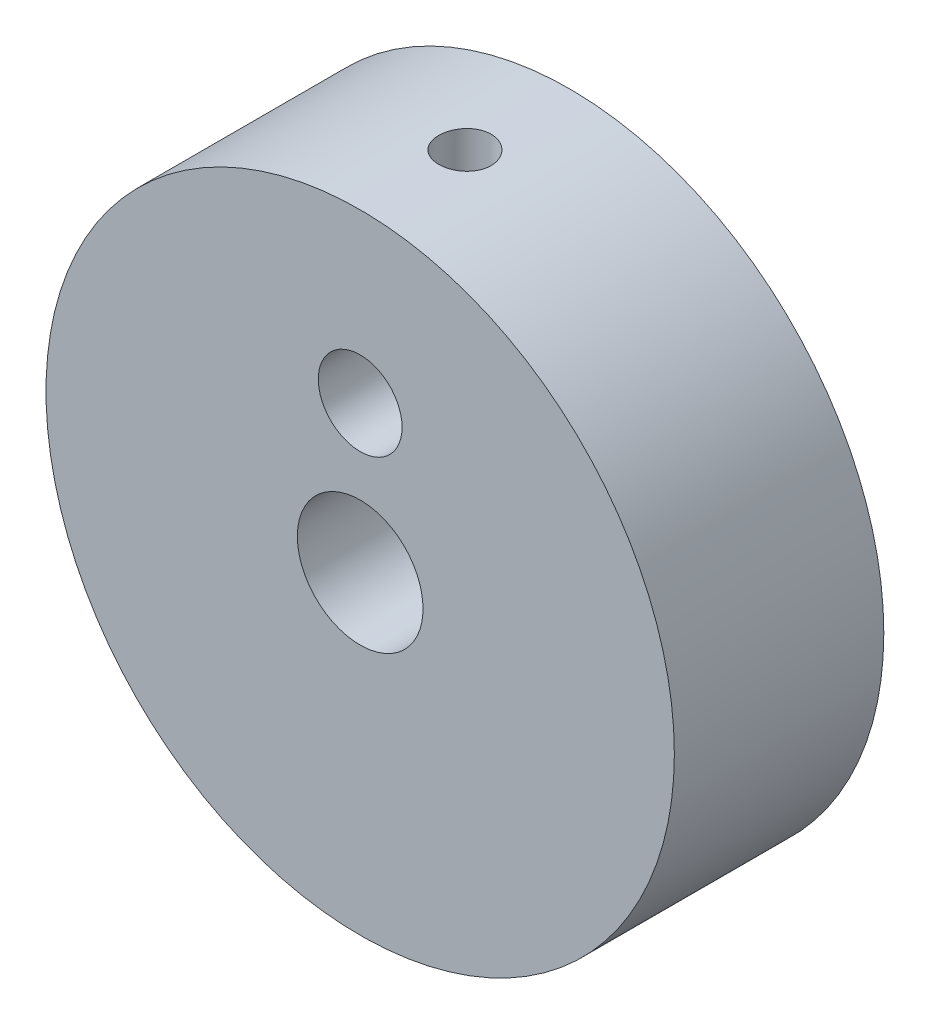
ISO-10303-21;
HEADER;
FILE_DESCRIPTION(('STEP AP214'),'2;1');
FILE_NAME('part.step','',(''),(''),'','','');
FILE_SCHEMA(('AUTOMOTIVE_DESIGN { 1 0 10303 214 1 1 1 1 }'));
ENDSEC;
DATA;
#1=APPLICATION_CONTEXT('core data for automotive mechanical design processes');
#2=APPLICATION_PROTOCOL_DEFINITION('international standard','automotive_design',2000,#1);
#3=PRODUCT_CONTEXT('',#1,'mechanical');
#4=PRODUCT('Part','Part','',(#3));
#5=PRODUCT_RELATED_PRODUCT_CATEGORY('part','',(#4));
#6=PRODUCT_DEFINITION_FORMATION('','',#4);
#7=PRODUCT_DEFINITION_CONTEXT('part definition',#1,'design');
#8=PRODUCT_DEFINITION('design','',#6,#7);
#9=PRODUCT_DEFINITION_SHAPE('','',#8);
#10=(LENGTH_UNIT() NAMED_UNIT(*) SI_UNIT(.MILLI.,.METRE.));
#11=(NAMED_UNIT(*) PLANE_ANGLE_UNIT() SI_UNIT($,.RADIAN.));
#12=(NAMED_UNIT(*) SI_UNIT($,.STERADIAN.) SOLID_ANGLE_UNIT());
#13=UNCERTAINTY_MEASURE_WITH_UNIT(LENGTH_MEASURE(1.E-05),#10,'distance_accuracy_value','');
#14=(GEOMETRIC_REPRESENTATION_CONTEXT(3) GLOBAL_UNCERTAINTY_ASSIGNED_CONTEXT((#13)) GLOBAL_UNIT_ASSIGNED_CONTEXT((#10,
#11,#12)) REPRESENTATION_CONTEXT('',''));
#15=CARTESIAN_POINT('',(0.,0.,0.));
#16=DIRECTION('',(0.,0.,1.));
#17=DIRECTION('',(1.,0.,0.));
#18=AXIS2_PLACEMENT_3D('',#15,#16,#17);
#19=CARTESIAN_POINT('',(0.,0.,10.));
#20=DIRECTION('',(0.,0.,-1.));
#21=DIRECTION('',(-1.,0.,0.));
#22=AXIS2_PLACEMENT_3D('',#19,#20,#21);
#23=CYLINDRICAL_SURFACE('',#22,15.);
#24=CARTESIAN_POINT('',(0.,-15.,3.75000000000001));
#25=CARTESIAN_POINT('',(-0.0700826124015049,-14.9999993176439,3.75000306103286));
#26=CARTESIAN_POINT('',(-0.140212933975281,-14.9995036067925,3.75591371226381));
#27=CARTESIAN_POINT('',(-0.278533213375485,-14.9975737791031,3.77940543981886));
#28=CARTESIAN_POINT('',(-0.346720881531536,-14.9961385991462,3.79699973788114));
#29=CARTESIAN_POINT('',(-0.479132528142823,-14.9924920155763,3.84334644226172));
#30=CARTESIAN_POINT('',(-0.543358725530766,-14.9902810512311,3.87209253513728));
#31=CARTESIAN_POINT('',(-0.666059041770091,-14.9853308468089,3.93991553984));
#32=CARTESIAN_POINT('',(-0.724534387356731,-14.982591719767,3.97899024184689));
#33=CARTESIAN_POINT('',(-0.834237499956983,-14.9768847483339,4.0664688332575));
#34=CARTESIAN_POINT('',(-0.885448590520196,-14.9739164010822,4.11489360491961));
#35=CARTESIAN_POINT('',(-0.979026416920687,-14.9680897600396,4.21965361981242));
#36=CARTESIAN_POINT('',(-1.02139276421438,-14.965231471088,4.27598921037828));
#37=CARTESIAN_POINT('',(-1.09613490298778,-14.9599431582655,4.39507264637379));
#38=CARTESIAN_POINT('',(-1.12849604118942,-14.9575137647512,4.45782971925347));
#39=CARTESIAN_POINT('',(-1.1822155422173,-14.9533640556034,4.58791036944498));
#40=CARTESIAN_POINT('',(-1.20357409939051,-14.9516437274454,4.65523386607281));
#41=CARTESIAN_POINT('',(-1.23463378727321,-14.949111150829,4.79236923985147));
#42=CARTESIAN_POINT('',(-1.24436208173721,-14.9482967867027,4.86217492499075));
#43=CARTESIAN_POINT('',(-1.25196901001928,-14.9476616540184,5.00243275493171));
#44=CARTESIAN_POINT('',(-1.24984786622442,-14.9478408668132,5.07288488757625));
#45=CARTESIAN_POINT('',(-1.23383858026855,-14.9491707170205,5.21224958188815));
#46=CARTESIAN_POINT('',(-1.21997996004757,-14.9503189172232,5.28116556134551));
#47=CARTESIAN_POINT('',(-1.18093498172867,-14.9534535446171,5.41568983424119));
#48=CARTESIAN_POINT('',(-1.15574851299598,-14.955439979995,5.48129809536731));
#49=CARTESIAN_POINT('',(-1.09472973519004,-14.9600300588357,5.60743863234762));
#50=CARTESIAN_POINT('',(-1.05888418094649,-14.962634469387,5.66796447198438));
#51=CARTESIAN_POINT('',(-0.977574304891681,-14.9681663357985,5.78215167352475));
#52=CARTESIAN_POINT('',(-0.932109788278174,-14.9710937982004,5.83581289637151));
#53=CARTESIAN_POINT('',(-0.832686977782951,-14.9769527551456,5.93491927410195));
#54=CARTESIAN_POINT('',(-0.778703161738217,-14.9798842346883,5.98033883016156));
#55=CARTESIAN_POINT('',(-0.663863195464687,-14.9854123983729,6.06147465423568));
#56=CARTESIAN_POINT('',(-0.603007040644171,-14.9880090822911,6.09719091576694));
#57=CARTESIAN_POINT('',(-0.476133241584814,-14.9925755726205,6.15790470333587));
#58=CARTESIAN_POINT('',(-0.410115052261343,-14.994545312718,6.18290109559769));
#59=CARTESIAN_POINT('',(-0.274798836274478,-14.9976352176475,6.22144766556415));
#60=CARTESIAN_POINT('',(-0.20550087771107,-14.9987554001111,6.23499808081907));
#61=CARTESIAN_POINT('',(-0.0658141252053163,-15.0000177117881,6.25023595505197));
#62=CARTESIAN_POINT('',(0.00457078639399187,-15.00016275615,6.25195877263361));
#63=CARTESIAN_POINT('',(0.144628440629125,-14.9994662347337,6.24358517421585));
#64=CARTESIAN_POINT('',(0.214301189901762,-14.9986246781584,6.23348886846317));
#65=CARTESIAN_POINT('',(0.350855945280869,-14.9960514730165,6.20179292673737));
#66=CARTESIAN_POINT('',(0.417741781424647,-14.9943210927178,6.18020967996773));
#67=CARTESIAN_POINT('',(0.546942706353105,-14.9901646264044,6.12616926527246));
#68=CARTESIAN_POINT('',(0.609257722853909,-14.9877385293905,6.09371192542687));
#69=CARTESIAN_POINT('',(0.727709022877376,-14.9824553299204,6.01875581347955));
#70=CARTESIAN_POINT('',(0.783830438151828,-14.9795972277342,5.97623361700646));
#71=CARTESIAN_POINT('',(0.888151368554517,-14.9737744829962,5.88238867868689));
#72=CARTESIAN_POINT('',(0.93635074601797,-14.9708098385941,5.83106578393841));
#73=CARTESIAN_POINT('',(1.02358068181887,-14.9650995151978,5.72092288475207));
#74=CARTESIAN_POINT('',(1.06258816654204,-14.9623543984278,5.66208457350325));
#75=CARTESIAN_POINT('',(1.13016882854939,-14.957401896804,5.53867217142073));
#76=CARTESIAN_POINT('',(1.15874211001245,-14.9551945065814,5.47409813786257));
#77=CARTESIAN_POINT('',(1.2046039718007,-14.9515705356118,5.34112901182595));
#78=CARTESIAN_POINT('',(1.2219066768116,-14.9501529653579,5.27273881910709));
#79=CARTESIAN_POINT('',(1.24478221238768,-14.9482658211356,5.13401162515697));
#80=CARTESIAN_POINT('',(1.25035526821032,-14.9477962289621,5.06367466133801));
#81=CARTESIAN_POINT('',(1.24961070361365,-14.9478584743774,4.92327984247388));
#82=CARTESIAN_POINT('',(1.24332933722173,-14.9483872586634,4.85322179095446));
#83=CARTESIAN_POINT('',(1.21912982911878,-14.9503801885288,4.71515933306144));
#84=CARTESIAN_POINT('',(1.20121166965953,-14.9518443355349,4.6471549298202));
#85=CARTESIAN_POINT('',(1.15425638752132,-14.9555422141463,4.51512779591673));
#86=CARTESIAN_POINT('',(1.12521991750816,-14.9577759005774,4.45110483179289));
#87=CARTESIAN_POINT('',(1.05685632368406,-14.9627612484384,4.32883644928292));
#88=CARTESIAN_POINT('',(1.01752936139319,-14.9655129017381,4.27059094023335));
#89=CARTESIAN_POINT('',(0.929564927653053,-14.9712341462335,4.16134532623374));
#90=CARTESIAN_POINT('',(0.880900617176818,-14.9742043500718,4.11036686417832));
#91=CARTESIAN_POINT('',(0.775691531990576,-14.980022437621,4.01728101849586));
#92=CARTESIAN_POINT('',(0.719144853301359,-14.9828702915603,3.97517578437999));
#93=CARTESIAN_POINT('',(0.599667216286764,-14.9881279355284,3.90097517447805));
#94=CARTESIAN_POINT('',(0.536724570338169,-14.9905369002888,3.8688985766796));
#95=CARTESIAN_POINT('',(0.406369689994664,-14.9946356564537,3.81581024618591));
#96=CARTESIAN_POINT('',(0.338962694267061,-14.9963262741032,3.79478579463988));
#97=CARTESIAN_POINT('',(0.225965060120847,-14.9983638466731,3.76975302187245));
#98=CARTESIAN_POINT('',(0.181101118048086,-14.9989746109619,3.76235548435315));
#99=CARTESIAN_POINT('',(0.0908314643764522,-14.9997929082329,3.7524779879035));
#100=CARTESIAN_POINT('',(0.0454257542163058,-15.0000004422857,3.74999801591692));
#101=CARTESIAN_POINT('',(0.,-15.,3.75000000000001));
#102=B_SPLINE_CURVE_WITH_KNOTS('',3,(#24,#25,#26,#27,#28,#29,#30,#31,#32,#33,#34,#35,#36,#37,
#38,#39,#40,#41,#42,#43,#44,#45,#46,#47,#48,#49,#50,#51,#52,#53,#54,#55,#56,#57,#58,#59,#60,#61,
#62,#63,#64,#65,#66,#67,#68,#69,#70,#71,#72,#73,#74,#75,#76,#77,#78,#79,#80,#81,#82,#83,#84,#85,
#86,#87,#88,#89,#90,#91,#92,#93,#94,#95,#96,#97,#98,#99,#100,#101),.UNSPECIFIED.,.T.,.F.,(4,2,2,
2,2,2,2,2,2,2,2,2,2,2,2,2,2,2,2,2,2,2,2,2,2,2,2,2,2,2,2,2,2,2,2,2,2,2,4),(0.,0.210081983500172,
0.420402111247291,0.630603342361189,0.840759636980221,1.0513908359822,1.26203128592414,
1.47297878688863,1.68392256159875,1.89437268539482,2.10481885953272,2.3147372888786,
2.52465776846247,2.73484019686122,2.94502688226073,3.15585563668935,3.36668453198304,
3.57753571988061,3.78838253165666,3.99859874133958,4.20881299017774,4.41872811288479,
4.62864655451712,4.83905843718655,5.0494739758906,5.26041220613999,5.47134833024781,
5.68201959051157,5.89268680498443,6.10271078603155,6.31273508740421,6.52274706184399,
6.73275574012316,6.94337735830794,7.15404994040596,7.36511466328187,7.57593595739727,
7.71210607945822,7.84827583998427),.UNSPECIFIED.);
#103=CARTESIAN_POINT('',(0.,-15.,3.75000000000001));
#104=VERTEX_POINT('',#103);
#105=EDGE_CURVE('E124',#104,#104,#102,.T.);
#106=ORIENTED_EDGE('',*,*,#105,.T.);
#107=EDGE_LOOP('',(#106));
#108=FACE_BOUND('',#107,.T.);
#109=CARTESIAN_POINT('',(0.,15.,6.24999999999999));
#110=CARTESIAN_POINT('',(-0.0700826124015049,14.9999993176439,6.24999693896714));
#111=CARTESIAN_POINT('',(-0.140212933975281,14.9995036067925,6.24408628773619));
#112=CARTESIAN_POINT('',(-0.278533213375485,14.9975737791031,6.22059456018114));
#113=CARTESIAN_POINT('',(-0.346720881531536,14.9961385991462,6.20300026211886));
#114=CARTESIAN_POINT('',(-0.479132528142823,14.9924920155763,6.15665355773828));
#115=CARTESIAN_POINT('',(-0.543358725530766,14.9902810512311,6.12790746486272));
#116=CARTESIAN_POINT('',(-0.666059041770091,14.9853308468089,6.06008446016));
#117=CARTESIAN_POINT('',(-0.724534387356731,14.982591719767,6.02100975815311));
#118=CARTESIAN_POINT('',(-0.834237499956983,14.9768847483339,5.9335311667425));
#119=CARTESIAN_POINT('',(-0.885448590520196,14.9739164010822,5.88510639508039));
#120=CARTESIAN_POINT('',(-0.979026416920686,14.9680897600396,5.78034638018758));
#121=CARTESIAN_POINT('',(-1.02139276421438,14.965231471088,5.72401078962172));
#122=CARTESIAN_POINT('',(-1.09613490298778,14.9599431582655,5.60492735362621));
#123=CARTESIAN_POINT('',(-1.12849604118942,14.9575137647512,5.54217028074653));
#124=CARTESIAN_POINT('',(-1.1822155422173,14.9533640556034,5.41208963055502));
#125=CARTESIAN_POINT('',(-1.20357409939051,14.9516437274454,5.34476613392718));
#126=CARTESIAN_POINT('',(-1.23463378727321,14.949111150829,5.20763076014853));
#127=CARTESIAN_POINT('',(-1.24436208173721,14.9482967867027,5.13782507500925));
#128=CARTESIAN_POINT('',(-1.25196901001928,14.9476616540184,4.99756724506829));
#129=CARTESIAN_POINT('',(-1.24984786622442,14.9478408668132,4.92711511242375));
#130=CARTESIAN_POINT('',(-1.23383858026855,14.9491707170205,4.78775041811185));
#131=CARTESIAN_POINT('',(-1.21997996004756,14.9503189172232,4.71883443865448));
#132=CARTESIAN_POINT('',(-1.18093498172867,14.9534535446171,4.58431016575881));
#133=CARTESIAN_POINT('',(-1.15574851299597,14.955439979995,4.51870190463269));
#134=CARTESIAN_POINT('',(-1.09472973519003,14.9600300588357,4.39256136765238));
#135=CARTESIAN_POINT('',(-1.05888418094648,14.962634469387,4.33203552801562));
#136=CARTESIAN_POINT('',(-0.977574304891678,14.9681663357985,4.21784832647525));
#137=CARTESIAN_POINT('',(-0.93210978827817,14.9710937982004,4.16418710362848));
#138=CARTESIAN_POINT('',(-0.832686977782948,14.9769527551456,4.06508072589805));
#139=CARTESIAN_POINT('',(-0.778703161738213,14.9798842346883,4.01966116983844));
#140=CARTESIAN_POINT('',(-0.663863195464683,14.9854123983729,3.93852534576431));
#141=CARTESIAN_POINT('',(-0.603007040644166,14.9880090822911,3.90280908423306));
#142=CARTESIAN_POINT('',(-0.476133241584809,14.9925755726205,3.84209529666412));
#143=CARTESIAN_POINT('',(-0.410115052261338,14.994545312718,3.81709890440231));
#144=CARTESIAN_POINT('',(-0.274798836274474,14.9976352176475,3.77855233443585));
#145=CARTESIAN_POINT('',(-0.205500877711065,14.9987554001111,3.76500191918093));
#146=CARTESIAN_POINT('',(-0.0658141252053113,15.0000177117881,3.74976404494803));
#147=CARTESIAN_POINT('',(0.00457078639399681,15.00016275615,3.74804122736639));
#148=CARTESIAN_POINT('',(0.14462844062913,14.9994662347337,3.75641482578415));
#149=CARTESIAN_POINT('',(0.214301189901767,14.9986246781584,3.76651113153683));
#150=CARTESIAN_POINT('',(0.350855945280874,14.9960514730165,3.79820707326263));
#151=CARTESIAN_POINT('',(0.417741781424652,14.9943210927178,3.81979032003227));
#152=CARTESIAN_POINT('',(0.54694270635311,14.9901646264044,3.87383073472754));
#153=CARTESIAN_POINT('',(0.609257722853914,14.9877385293905,3.90628807457313));
#154=CARTESIAN_POINT('',(0.727709022877381,14.9824553299204,3.98124418652045));
#155=CARTESIAN_POINT('',(0.783830438151834,14.9795972277342,4.02376638299354));
#156=CARTESIAN_POINT('',(0.888151368554523,14.9737744829962,4.11761132131311));
#157=CARTESIAN_POINT('',(0.936350746017976,14.9708098385941,4.16893421606159));
#158=CARTESIAN_POINT('',(1.02358068181887,14.9650995151978,4.27907711524793));
#159=CARTESIAN_POINT('',(1.06258816654204,14.9623543984278,4.33791542649675));
#160=CARTESIAN_POINT('',(1.13016882854939,14.957401896804,4.46132782857927));
#161=CARTESIAN_POINT('',(1.15874211001245,14.9551945065814,4.52590186213743));
#162=CARTESIAN_POINT('',(1.2046039718007,14.9515705356118,4.65887098817405));
#163=CARTESIAN_POINT('',(1.22190667681161,14.9501529653579,4.72726118089292));
#164=CARTESIAN_POINT('',(1.24478221238769,14.9482658211356,4.86598837484303));
#165=CARTESIAN_POINT('',(1.25035526821033,14.9477962289621,4.936325338662));
#166=CARTESIAN_POINT('',(1.24961070361366,14.9478584743774,5.07672015752612));
#167=CARTESIAN_POINT('',(1.24332933722173,14.9483872586634,5.14677820904555));
#168=CARTESIAN_POINT('',(1.21912982911878,14.9503801885288,5.28484066693856));
#169=CARTESIAN_POINT('',(1.20121166965953,14.9518443355349,5.3528450701798));
#170=CARTESIAN_POINT('',(1.15425638752132,14.9555422141463,5.48487220408327));
#171=CARTESIAN_POINT('',(1.12521991750816,14.9577759005774,5.54889516820711));
#172=CARTESIAN_POINT('',(1.05685632368406,14.9627612484384,5.67116355071708));
#173=CARTESIAN_POINT('',(1.01752936139319,14.9655129017381,5.72940905976665));
#174=CARTESIAN_POINT('',(0.929564927653055,14.9712341462335,5.83865467376626));
#175=CARTESIAN_POINT('',(0.88090061717682,14.9742043500718,5.88963313582168));
#176=CARTESIAN_POINT('',(0.775691531990578,14.980022437621,5.98271898150414));
#177=CARTESIAN_POINT('',(0.719144853301361,14.9828702915603,6.02482421562001));
#178=CARTESIAN_POINT('',(0.599667216286765,14.9881279355284,6.09902482552195));
#179=CARTESIAN_POINT('',(0.53672457033817,14.9905369002888,6.1311014233204));
#180=CARTESIAN_POINT('',(0.406369689994665,14.9946356564537,6.18418975381409));
#181=CARTESIAN_POINT('',(0.338962694267062,14.9963262741032,6.20521420536012));
#182=CARTESIAN_POINT('',(0.225965060120848,14.9983638466731,6.23024697812755));
#183=CARTESIAN_POINT('',(0.181101118048087,14.9989746109619,6.23764451564685));
#184=CARTESIAN_POINT('',(0.0908314643764526,14.9997929082329,6.2475220120965));
#185=CARTESIAN_POINT('',(0.045425754216306,15.0000004422857,6.25000198408308));
#186=CARTESIAN_POINT('',(0.,15.,6.24999999999999));
#187=B_SPLINE_CURVE_WITH_KNOTS('',3,(#109,#110,#111,#112,#113,#114,#115,#116,#117,#118,#119,
#120,#121,#122,#123,#124,#125,#126,#127,#128,#129,#130,#131,#132,#133,#134,#135,#136,#137,#138,
#139,#140,#141,#142,#143,#144,#145,#146,#147,#148,#149,#150,#151,#152,#153,#154,#155,#156,#157,
#158,#159,#160,#161,#162,#163,#164,#165,#166,#167,#168,#169,#170,#171,#172,#173,#174,#175,#176,
#177,#178,#179,#180,#181,#182,#183,#184,#185,#186),.UNSPECIFIED.,.T.,.F.,(4,2,2,2,2,2,2,2,2,2,2,
2,2,2,2,2,2,2,2,2,2,2,2,2,2,2,2,2,2,2,2,2,2,2,2,2,2,2,4),(0.,0.210081983500173,
0.420402111247291,0.630603342361189,0.840759636980221,1.0513908359822,1.26203128592414,
1.47297878688863,1.68392256159875,1.89437268539482,2.10481885953272,2.31473728887861,
2.52465776846247,2.73484019686122,2.94502688226073,3.15585563668935,3.36668453198304,
3.57753571988061,3.78838253165666,3.99859874133958,4.20881299017774,4.41872811288479,
4.62864655451712,4.83905843718655,5.0494739758906,5.26041220613999,5.47134833024782,
5.68201959051157,5.89268680498444,6.10271078603156,6.31273508740421,6.52274706184399,
6.73275574012316,6.94337735830794,7.15404994040597,7.36511466328188,7.57593595739727,
7.71210607945823,7.84827583998428),.UNSPECIFIED.);
#188=CARTESIAN_POINT('',(0.,15.,6.24999999999999));
#189=VERTEX_POINT('',#188);
#190=EDGE_CURVE('E73',#189,#189,#187,.T.);
#191=ORIENTED_EDGE('',*,*,#190,.T.);
#192=EDGE_LOOP('',(#191));
#193=FACE_BOUND('',#192,.T.);
#194=CARTESIAN_POINT('',(0.,0.,10.));
#195=DIRECTION('',(0.,0.,1.));
#196=DIRECTION('',(1.,0.,0.));
#197=AXIS2_PLACEMENT_3D('',#194,#195,#196);
#198=CIRCLE('',#197,15.);
#199=CARTESIAN_POINT('',(15.,0.,10.));
#200=VERTEX_POINT('',#199);
#201=EDGE_CURVE('E11',#200,#200,#198,.T.);
#202=ORIENTED_EDGE('',*,*,#201,.F.);
#203=EDGE_LOOP('',(#202));
#204=FACE_BOUND('',#203,.T.);
#205=CARTESIAN_POINT('',(0.,0.,0.));
#206=DIRECTION('',(0.,0.,1.));
#207=DIRECTION('',(1.,0.,0.));
#208=AXIS2_PLACEMENT_3D('',#205,#206,#207);
#209=CIRCLE('',#208,15.);
#210=CARTESIAN_POINT('',(15.,0.,0.));
#211=VERTEX_POINT('',#210);
#212=EDGE_CURVE('E55',#211,#211,#209,.T.);
#213=ORIENTED_EDGE('',*,*,#212,.T.);
#214=EDGE_LOOP('',(#213));
#215=FACE_BOUND('',#214,.T.);
#216=ADVANCED_FACE('F51',(#108,#193,#204,#215),#23,.T.);
#217=CARTESIAN_POINT('',(0.,0.,10.));
#218=DIRECTION('',(0.,0.,1.));
#219=DIRECTION('',(1.,0.,0.));
#220=AXIS2_PLACEMENT_3D('',#217,#218,#219);
#221=PLANE('',#220);
#222=CARTESIAN_POINT('',(0.,7.,10.));
#223=DIRECTION('',(0.,0.,1.));
#224=DIRECTION('',(1.,0.,0.));
#225=AXIS2_PLACEMENT_3D('',#222,#223,#224);
#226=CIRCLE('',#225,2.);
#227=CARTESIAN_POINT('',(2.,7.,10.));
#228=VERTEX_POINT('',#227);
#229=EDGE_CURVE('E70',#228,#228,#226,.T.);
#230=ORIENTED_EDGE('',*,*,#229,.F.);
#231=EDGE_LOOP('',(#230));
#232=FACE_BOUND('',#231,.T.);
#233=CARTESIAN_POINT('',(0.,0.,10.));
#234=DIRECTION('',(0.,0.,-1.));
#235=DIRECTION('',(-1.,0.,0.));
#236=AXIS2_PLACEMENT_3D('',#233,#234,#235);
#237=CIRCLE('',#236,3.);
#238=CARTESIAN_POINT('',(-3.,0.,10.));
#239=VERTEX_POINT('',#238);
#240=EDGE_CURVE('E62',#239,#239,#237,.T.);
#241=ORIENTED_EDGE('',*,*,#240,.T.);
#242=EDGE_LOOP('',(#241));
#243=FACE_BOUND('',#242,.T.);
#244=ORIENTED_EDGE('',*,*,#201,.T.);
#245=EDGE_LOOP('',(#244));
#246=FACE_BOUND('',#245,.T.);
#247=ADVANCED_FACE('F108',(#232,#243,#246),#221,.T.);
#248=CARTESIAN_POINT('',(0.,0.,0.));
#249=DIRECTION('',(0.,0.,1.));
#250=DIRECTION('',(1.,0.,0.));
#251=AXIS2_PLACEMENT_3D('',#248,#249,#250);
#252=PLANE('',#251);
#253=CARTESIAN_POINT('',(0.,7.,0.));
#254=DIRECTION('',(0.,0.,1.));
#255=DIRECTION('',(1.,0.,0.));
#256=AXIS2_PLACEMENT_3D('',#253,#254,#255);
#257=CIRCLE('',#256,2.);
#258=CARTESIAN_POINT('',(2.,7.,0.));
#259=VERTEX_POINT('',#258);
#260=EDGE_CURVE('E67',#259,#259,#257,.T.);
#261=ORIENTED_EDGE('',*,*,#260,.T.);
#262=EDGE_LOOP('',(#261));
#263=FACE_BOUND('',#262,.T.);
#264=CARTESIAN_POINT('',(0.,0.,0.));
#265=DIRECTION('',(0.,0.,-1.));
#266=DIRECTION('',(-1.,0.,0.));
#267=AXIS2_PLACEMENT_3D('',#264,#265,#266);
#268=CIRCLE('',#267,3.);
#269=CARTESIAN_POINT('',(-3.,0.,0.));
#270=VERTEX_POINT('',#269);
#271=EDGE_CURVE('E64',#270,#270,#268,.T.);
#272=ORIENTED_EDGE('',*,*,#271,.F.);
#273=EDGE_LOOP('',(#272));
#274=FACE_BOUND('',#273,.T.);
#275=ORIENTED_EDGE('',*,*,#212,.F.);
#276=EDGE_LOOP('',(#275));
#277=FACE_BOUND('',#276,.T.);
#278=ADVANCED_FACE('F106',(#263,#274,#277),#252,.F.);
#279=CARTESIAN_POINT('',(0.,0.,10.));
#280=DIRECTION('',(0.,0.,-1.));
#281=DIRECTION('',(-1.,0.,0.));
#282=AXIS2_PLACEMENT_3D('',#279,#280,#281);
#283=CYLINDRICAL_SURFACE('',#282,3.);
#284=CARTESIAN_POINT('',(0.,-3.,3.75000000000001));
#285=CARTESIAN_POINT('',(0.0669580526362648,-2.99999458367273,3.75000720509131));
#286=CARTESIAN_POINT('',(0.134021397063839,-2.9977323297471,3.75541195852814));
#287=CARTESIAN_POINT('',(0.266247371156344,-2.98890153579552,3.77683906492019));
#288=CARTESIAN_POINT('',(0.331404576423561,-2.98232175901028,3.79288912446426));
#289=CARTESIAN_POINT('',(0.457688733653084,-2.96556289038127,3.8349110917806));
#290=CARTESIAN_POINT('',(0.518828524426264,-2.95539599975004,3.86084938946816));
#291=CARTESIAN_POINT('',(0.635829756679797,-2.93245286470664,3.92177282323257));
#292=CARTESIAN_POINT('',(0.691692790015934,-2.91967741092849,3.95675521897087));
#293=CARTESIAN_POINT('',(0.799448403559506,-2.89207828351869,4.03662898259089));
#294=CARTESIAN_POINT('',(0.851041267517762,-2.87718753326093,4.08190130878976));
#295=CARTESIAN_POINT('',(0.946159821091255,-2.84732714068514,4.18026433478257));
#296=CARTESIAN_POINT('',(0.989681263153078,-2.8323574610681,4.23335912489451));
#297=CARTESIAN_POINT('',(1.06953737697065,-2.80321021812995,4.3490267775649));
#298=CARTESIAN_POINT('',(1.10541308153924,-2.78910786873385,4.41193744842655));
#299=CARTESIAN_POINT('',(1.16593940588865,-2.76435572357005,4.54357325792093));
#300=CARTESIAN_POINT('',(1.1905958083629,-2.75370415000824,4.61229537948445));
#301=CARTESIAN_POINT('',(1.22674598312158,-2.73778555387705,4.75015369176792));
#302=CARTESIAN_POINT('',(1.23881657877605,-2.73228387651787,4.81911048339215));
#303=CARTESIAN_POINT('',(1.25125209967795,-2.72661326219504,4.95827329268657));
#304=CARTESIAN_POINT('',(1.25162348054396,-2.7264413842526,5.02847860002574));
#305=CARTESIAN_POINT('',(1.24108450363673,-2.73125119560853,5.16240006043494));
#306=CARTESIAN_POINT('',(1.231036811123,-2.73583882723623,5.22620109656446));
#307=CARTESIAN_POINT('',(1.20139191015776,-2.74898482773797,5.35111209100039));
#308=CARTESIAN_POINT('',(1.18179287287176,-2.75754395703564,5.41222153149177));
#309=CARTESIAN_POINT('',(1.1332195872757,-2.77786184772757,5.53155770299144));
#310=CARTESIAN_POINT('',(1.10405471539235,-2.78968481949137,5.58969542091338));
#311=CARTESIAN_POINT('',(1.03731242580562,-2.81518331141086,5.70047773388014));
#312=CARTESIAN_POINT('',(0.999731690519537,-2.8288595612978,5.75312015061351));
#313=CARTESIAN_POINT('',(0.913495965543828,-2.85792976877979,5.85609995873283));
#314=CARTESIAN_POINT('',(0.86417348320752,-2.87337121404473,5.90586656738543));
#315=CARTESIAN_POINT('',(0.757729591051506,-2.90325673112529,5.99661350295918));
#316=CARTESIAN_POINT('',(0.700606359448451,-2.9177005687701,6.03759177169217));
#317=CARTESIAN_POINT('',(0.578447948693371,-2.94438283556473,6.11043582361626));
#318=CARTESIAN_POINT('',(0.513260582447675,-2.95656266543334,6.14206944515068));
#319=CARTESIAN_POINT('',(0.377852402526827,-2.97689481414803,6.19372113960325));
#320=CARTESIAN_POINT('',(0.307634394795031,-2.985049358458,6.21374563194381));
#321=CARTESIAN_POINT('',(0.168928113346225,-2.99599641186385,6.24041599212663));
#322=CARTESIAN_POINT('',(0.100611285278637,-2.99909541047125,6.24782785744374));
#323=CARTESIAN_POINT('',(-0.0363546554960909,-3.00056050368745,6.25134622361409));
#324=CARTESIAN_POINT('',(-0.105003667152637,-2.99892795711939,6.24745597025199));
#325=CARTESIAN_POINT('',(-0.237098242341436,-2.9913121765694,6.22902891519393));
#326=CARTESIAN_POINT('',(-0.300632966639387,-2.9855488728399,6.21503004590279));
#327=CARTESIAN_POINT('',(-0.42438274897109,-2.97048606772414,6.17753180545921));
#328=CARTESIAN_POINT('',(-0.48459738651836,-2.96118611959704,6.15403123404969));
#329=CARTESIAN_POINT('',(-0.602108999869136,-2.93958270645166,6.09742902428788));
#330=CARTESIAN_POINT('',(-0.659257236855323,-2.92719491469281,6.06405181685396));
#331=CARTESIAN_POINT('',(-0.767346216231428,-2.9007380457909,5.9889466222083));
#332=CARTESIAN_POINT('',(-0.818284352601939,-2.88666826768733,5.94721514847072));
#333=CARTESIAN_POINT('',(-0.916333430274261,-2.85712087895438,5.85309676672759));
#334=CARTESIAN_POINT('',(-0.962910697979832,-2.84161451591029,5.80016149701373));
#335=CARTESIAN_POINT('',(-1.0466698461055,-2.81184336768005,5.6869787240646));
#336=CARTESIAN_POINT('',(-1.08384959285617,-2.79757886493439,5.62672956482826));
#337=CARTESIAN_POINT('',(-1.14815960208699,-2.77181386243988,5.49938582469742));
#338=CARTESIAN_POINT('',(-1.17513918237328,-2.76035562555112,5.43220596448517));
#339=CARTESIAN_POINT('',(-1.21717413951572,-2.74208355658957,5.29362940618989));
#340=CARTESIAN_POINT('',(-1.23223934863687,-2.73526589555752,5.22223623751665));
#341=CARTESIAN_POINT('',(-1.249040803489,-2.72763164537264,5.08318130080079));
#342=CARTESIAN_POINT('',(-1.25171380413129,-2.72639350967163,5.01565533770738));
#343=CARTESIAN_POINT('',(-1.24615575523912,-2.72893853011024,4.8811571388589));
#344=CARTESIAN_POINT('',(-1.23792637964721,-2.73272091540307,4.8141848196863));
#345=CARTESIAN_POINT('',(-1.21158404780491,-2.74449551302268,4.68590725253111));
#346=CARTESIAN_POINT('',(-1.19394903571466,-2.75228354846481,4.62448332653661));
#347=CARTESIAN_POINT('',(-1.14976328202134,-2.77103181199189,4.50545197864277));
#348=CARTESIAN_POINT('',(-1.12321003517251,-2.78199293131694,4.44784563460122));
#349=CARTESIAN_POINT('',(-1.06010285935489,-2.80666954560013,4.33430410405088));
#350=CARTESIAN_POINT('',(-1.02304360910483,-2.8205110271368,4.27867766983171));
#351=CARTESIAN_POINT('',(-0.940684072630386,-2.84903689053839,4.17413986063932));
#352=CARTESIAN_POINT('',(-0.895380928905614,-2.86372156345875,4.12523082439943));
#353=CARTESIAN_POINT('',(-0.793902045778816,-2.89356392850106,4.03185131831526));
#354=CARTESIAN_POINT('',(-0.737174739949023,-2.90867817511792,3.98796356715935));
#355=CARTESIAN_POINT('',(-0.616600079253194,-2.9366014362202,3.91030054645638));
#356=CARTESIAN_POINT('',(-0.552749497945742,-2.94940939916741,3.87652988511045));
#357=CARTESIAN_POINT('',(-0.420732056717947,-2.97109183362461,3.82079015456012));
#358=CARTESIAN_POINT('',(-0.352653990980633,-2.98002782581964,3.79863523338271));
#359=CARTESIAN_POINT('',(-0.213410421846557,-2.99321009768625,3.76629367092217));
#360=CARTESIAN_POINT('',(-0.142255316980956,-2.99747105811967,3.75606955747012));
#361=CARTESIAN_POINT('',(-0.0472360819191829,-2.99972287568934,3.75066683891356));
#362=CARTESIAN_POINT('',(-0.0236245946756577,-3.00000191102536,3.74999745785078));
#363=CARTESIAN_POINT('',(0.,-3.,3.75000000000001));
#364=B_SPLINE_CURVE_WITH_KNOTS('',3,(#284,#285,#286,#287,#288,#289,#290,#291,#292,#293,#294,
#295,#296,#297,#298,#299,#300,#301,#302,#303,#304,#305,#306,#307,#308,#309,#310,#311,#312,#313,
#314,#315,#316,#317,#318,#319,#320,#321,#322,#323,#324,#325,#326,#327,#328,#329,#330,#331,#332,
#333,#334,#335,#336,#337,#338,#339,#340,#341,#342,#343,#344,#345,#346,#347,#348,#349,#350,#351,
#352,#353,#354,#355,#356,#357,#358,#359,#360,#361,#362,#363),.UNSPECIFIED.,.T.,.F.,(4,2,2,2,2,2,
2,2,2,2,2,2,2,2,2,2,2,2,2,2,2,2,2,2,2,2,2,2,2,2,2,2,2,2,2,2,2,2,2,4),(0.,0.200806918883938,
0.402138540628694,0.602791851906298,0.80338443685297,1.01317936288806,1.22308438131465,
1.44331724539124,1.66343646730587,1.87295273137556,2.08235338249045,2.27570157202555,
2.46908679727211,2.66658713058713,2.86416545717205,3.07844141127895,3.29276749314586,
3.51204055060811,3.73119224218295,3.93648443393249,4.1417176749317,4.33676589735719,
4.53183876601782,4.73297135272158,4.93418805469493,5.14978488029291,5.36543061240338,
5.5841478835952,5.80268447074577,6.0043987755964,6.20608211297533,6.39837649964759,
6.59072494950609,6.79463893397437,6.9986237342594,7.21746535004885,7.43640649428578,
7.65172855819381,7.86637250469317,7.93722256499093),.UNSPECIFIED.);
#365=CARTESIAN_POINT('',(0.,-3.,3.75000000000001));
#366=VERTEX_POINT('',#365);
#367=EDGE_CURVE('E132',#366,#366,#364,.T.);
#368=ORIENTED_EDGE('',*,*,#367,.T.);
#369=EDGE_LOOP('',(#368));
#370=FACE_BOUND('',#369,.T.);
#371=ORIENTED_EDGE('',*,*,#240,.F.);
#372=EDGE_LOOP('',(#371));
#373=FACE_BOUND('',#372,.T.);
#374=ORIENTED_EDGE('',*,*,#271,.T.);
#375=EDGE_LOOP('',(#374));
#376=FACE_BOUND('',#375,.T.);
#377=ADVANCED_FACE('F102',(#370,#373,#376),#283,.F.);
#378=CARTESIAN_POINT('',(0.,7.,0.));
#379=DIRECTION('',(0.,0.,1.));
#380=DIRECTION('',(1.,0.,0.));
#381=AXIS2_PLACEMENT_3D('',#378,#379,#380);
#382=CYLINDRICAL_SURFACE('',#381,2.);
#383=CARTESIAN_POINT('',(0.,9.,6.24999999999999));
#384=CARTESIAN_POINT('',(0.0635104730002035,8.99999595305313,6.24999565000121));
#385=CARTESIAN_POINT('',(0.127096441053758,8.99694323311001,6.24512698818218));
#386=CARTESIAN_POINT('',(0.252318262265282,8.98502167724102,6.22591419657049));
#387=CARTESIAN_POINT('',(0.313950163299073,8.97614175574896,6.21155200607451));
#388=CARTESIAN_POINT('',(0.433205558136782,8.95345852982134,6.17418863683794));
#389=CARTESIAN_POINT('',(0.490847243665016,8.93967960778663,6.15123021215911));
#390=CARTESIAN_POINT('',(0.601260368868359,8.90834598486073,6.09761414920324));
#391=CARTESIAN_POINT('',(0.65403234727615,8.89079170235271,6.0669573639908));
#392=CARTESIAN_POINT('',(0.757974192167971,8.85170152902273,5.99611342681502));
#393=CARTESIAN_POINT('',(0.808679560769974,8.82995962224617,5.95536070002454));
#394=CARTESIAN_POINT('',(0.902986375146756,8.78531349913632,5.86678082549344));
#395=CARTESIAN_POINT('',(0.94657810721573,8.76240774858553,5.81894417174206));
#396=CARTESIAN_POINT('',(1.03142873237132,8.71430418655199,5.70996610579548));
#397=CARTESIAN_POINT('',(1.0715720602915,8.68921610993413,5.64790021339272));
#398=CARTESIAN_POINT('',(1.14073966020039,8.64330198128731,5.51643518455281));
#399=CARTESIAN_POINT('',(1.16978270899534,8.62246875996239,5.44704868742392));
#400=CARTESIAN_POINT('',(1.2093340058598,8.59309575627364,5.32118947622128));
#401=CARTESIAN_POINT('',(1.22269552371393,8.58276905990074,5.26603318146118));
#402=CARTESIAN_POINT('',(1.24181843585479,8.56781357325806,5.1536940743892));
#403=CARTESIAN_POINT('',(1.24759056342087,8.56317673673693,5.09651424172551));
#404=CARTESIAN_POINT('',(1.25118918245719,8.56029885782828,4.98158698324888));
#405=CARTESIAN_POINT('',(1.2489948372785,8.56207458771719,4.9238384635376));
#406=CARTESIAN_POINT('',(1.23676317046804,8.5717740238392,4.80968989681104));
#407=CARTESIAN_POINT('',(1.22671956265043,8.57970265767111,4.75329096796092));
#408=CARTESIAN_POINT('',(1.19968103371474,8.60032573121781,4.64456154734252));
#409=CARTESIAN_POINT('',(1.18285016736896,8.61290715104814,4.59216754431573));
#410=CARTESIAN_POINT('',(1.14290189820937,8.64145566443406,4.49083881759458));
#411=CARTESIAN_POINT('',(1.11978227193695,8.65742395501354,4.44190532512551));
#412=CARTESIAN_POINT('',(1.06294892954948,8.6945481599302,4.33916672616726));
#413=CARTESIAN_POINT('',(1.0280629660117,8.71611591575959,4.28615918987961));
#414=CARTESIAN_POINT('',(0.950881463002095,8.76005711791244,4.18616972099953));
#415=CARTESIAN_POINT('',(0.908578308011431,8.78243137335976,4.13919406829348));
#416=CARTESIAN_POINT('',(0.809519713023326,8.82979894916857,4.04469825062961));
#417=CARTESIAN_POINT('',(0.751531353595327,8.85461531676593,3.99836702574117));
#418=CARTESIAN_POINT('',(0.627148099593564,8.90028055062445,3.91614910411276));
#419=CARTESIAN_POINT('',(0.560756523881994,8.92113097514764,3.88025830227108));
#420=CARTESIAN_POINT('',(0.424883562934744,8.95553372961316,3.82223631161858));
#421=CARTESIAN_POINT('',(0.355763457732367,8.96941976591574,3.79946596001882));
#422=CARTESIAN_POINT('',(0.213612154574973,8.98984929310048,3.76623507201719));
#423=CARTESIAN_POINT('',(0.140586648341302,8.9964031799007,3.755757105778));
#424=CARTESIAN_POINT('',(0.00451561874058679,9.00097840540091,3.74843414993881));
#425=CARTESIAN_POINT('',(-0.0584027741637861,9.00012161345511,3.74979682204615));
#426=CARTESIAN_POINT('',(-0.18297211799631,8.99258901494327,3.76188282842073));
#427=CARTESIAN_POINT('',(-0.244623154962733,8.98591360473592,3.77260552509217));
#428=CARTESIAN_POINT('',(-0.362521070658189,8.9677405228307,3.80223853669197));
#429=CARTESIAN_POINT('',(-0.418885009953204,8.95644170526844,3.82081215679666));
#430=CARTESIAN_POINT('',(-0.527638281070987,8.92995684104751,3.86529638927857));
#431=CARTESIAN_POINT('',(-0.580026945470714,8.91477014350266,3.89120823025516));
#432=CARTESIAN_POINT('',(-0.685084056277255,8.87990012356001,3.95251520599549));
#433=CARTESIAN_POINT('',(-0.737246967843402,8.85991764817225,3.98860356923825));
#434=CARTESIAN_POINT('',(-0.835142640217338,8.81806970001717,4.06779386515282));
#435=CARTESIAN_POINT('',(-0.880868151291851,8.79620214826384,4.11090358925455));
#436=CARTESIAN_POINT('',(-0.971474198022879,8.74905869713091,4.21013503941266));
#437=CARTESIAN_POINT('',(-1.01526851939752,8.72374883414957,4.26723720629479));
#438=CARTESIAN_POINT('',(-1.09280351885683,8.67566762748172,4.38887578494426));
#439=CARTESIAN_POINT('',(-1.12655115718693,8.65289453322337,4.453407006753));
#440=CARTESIAN_POINT('',(-1.17684772011827,8.61733530314592,4.57469214805688));
#441=CARTESIAN_POINT('',(-1.19551895865479,8.6034563619378,4.63024075073223));
#442=CARTESIAN_POINT('',(-1.22500108205244,8.58105030663768,4.74439314576893));
#443=CARTESIAN_POINT('',(-1.23582424983126,8.57251483242606,4.80299200945147));
#444=CARTESIAN_POINT('',(-1.24901383653653,8.56206324988732,4.92209027688069));
#445=CARTESIAN_POINT('',(-1.25133186963292,8.5601850167457,4.98259858548818));
#446=CARTESIAN_POINT('',(-1.24719778716817,8.56349063109848,5.10313096036604));
#447=CARTESIAN_POINT('',(-1.24074275650142,8.56867682595587,5.16315485900952));
#448=CARTESIAN_POINT('',(-1.22038272403399,8.58455388771335,5.27602979505136));
#449=CARTESIAN_POINT('',(-1.20711919499769,8.59476808051061,5.32906930141642));
#450=CARTESIAN_POINT('',(-1.17417623469512,8.61917530435691,5.43213505958591));
#451=CARTESIAN_POINT('',(-1.15449412799406,8.63336999423728,5.48216004453751));
#452=CARTESIAN_POINT('',(-1.10602690439617,8.66663902886519,5.5855967438727));
#453=CARTESIAN_POINT('',(-1.07633644455459,8.68612230498998,5.63845029847656));
#454=CARTESIAN_POINT('',(-1.01000017036388,8.72667706411868,5.73893836724601));
#455=CARTESIAN_POINT('',(-0.973348732866932,8.74774982276826,5.78656861256048));
#456=CARTESIAN_POINT('',(-0.885670221416051,8.79401910731182,5.88501425497784));
#457=CARTESIAN_POINT('',(-0.833233674246786,8.81920541808777,5.93459084544548));
#458=CARTESIAN_POINT('',(-0.719822446025195,8.86698729056748,6.02449482970524));
#459=CARTESIAN_POINT('',(-0.65884251513854,8.88958124364395,6.0648164959274));
#460=CARTESIAN_POINT('',(-0.529355399891398,8.92986710976549,6.1347711301241));
#461=CARTESIAN_POINT('',(-0.460835727056561,8.94755071355357,6.16438600540584));
#462=CARTESIAN_POINT('',(-0.318394712729491,8.97581521637843,6.21107188433174));
#463=CARTESIAN_POINT('',(-0.244493501106842,8.98642121428689,6.22818723486978));
#464=CARTESIAN_POINT('',(-0.141418481224657,8.99519472168143,6.24229920916262));
#465=CARTESIAN_POINT('',(-0.113248608862864,8.99699172226302,6.24518186533396));
#466=CARTESIAN_POINT('',(-0.0567241864870864,8.9993953021324,6.2490332915376));
#467=CARTESIAN_POINT('',(-0.0283696251514504,9.00000180773911,6.25000194310999));
#468=CARTESIAN_POINT('',(0.,9.,6.24999999999999));
#469=B_SPLINE_CURVE_WITH_KNOTS('',3,(#383,#384,#385,#386,#387,#388,#389,#390,#391,#392,#393,
#394,#395,#396,#397,#398,#399,#400,#401,#402,#403,#404,#405,#406,#407,#408,#409,#410,#411,#412,
#413,#414,#415,#416,#417,#418,#419,#420,#421,#422,#423,#424,#425,#426,#427,#428,#429,#430,#431,
#432,#433,#434,#435,#436,#437,#438,#439,#440,#441,#442,#443,#444,#445,#446,#447,#448,#449,#450,
#451,#452,#453,#454,#455,#456,#457,#458,#459,#460,#461,#462,#463,#464,#465,#466,#467,#468),
.UNSPECIFIED.,.T.,.F.,(4,2,2,2,2,2,2,2,2,2,2,2,2,2,2,2,2,2,2,2,2,2,2,2,2,2,2,2,2,2,2,2,2,2,2,2,
2,2,2,2,2,2,4),(0.,0.190412301434132,0.38118789412846,0.571026987595135,0.760845054038792,
0.965821870536214,1.17107628325701,1.40412975852973,1.6367872460701,1.80912008879716,
1.9812089470739,2.15374823498777,2.32642584505082,2.49515839460435,2.66395067908032,
2.86427450354358,3.0648052257518,3.2984218069952,3.53194640727859,3.75284174135957,
3.97342347958129,4.16127180597571,4.34910733732278,4.52959504531296,4.71011298928464,
4.9088523099055,5.10781368827683,5.33565708863711,5.56334227196908,5.74329940313717,
5.92297427413349,6.10366974688197,6.28442527563861,6.45063169037738,6.61690747313439,
6.80725523036975,6.99775741153766,7.22600539035108,7.45439424578496,7.68316725607074,
7.91112460944404,7.99617501232476,8.08123067890583),.UNSPECIFIED.);
#470=CARTESIAN_POINT('',(0.,9.,6.24999999999999));
#471=VERTEX_POINT('',#470);
#472=EDGE_CURVE('E82',#471,#471,#469,.T.);
#473=ORIENTED_EDGE('',*,*,#472,.T.);
#474=EDGE_LOOP('',(#473));
#475=FACE_BOUND('',#474,.T.);
#476=ORIENTED_EDGE('',*,*,#260,.F.);
#477=EDGE_LOOP('',(#476));
#478=FACE_BOUND('',#477,.T.);
#479=ORIENTED_EDGE('',*,*,#229,.T.);
#480=EDGE_LOOP('',(#479));
#481=FACE_BOUND('',#480,.T.);
#482=ADVANCED_FACE('F93',(#475,#478,#481),#382,.F.);
#483=CARTESIAN_POINT('',(0.,15.,5.));
#484=DIRECTION('',(0.,1.,0.));
#485=DIRECTION('',(0.,0.,1.));
#486=AXIS2_PLACEMENT_3D('',#483,#484,#485);
#487=CYLINDRICAL_SURFACE('',#486,1.24999999999999);
#488=ORIENTED_EDGE('',*,*,#472,.F.);
#489=EDGE_LOOP('',(#488));
#490=FACE_BOUND('',#489,.T.);
#491=ORIENTED_EDGE('',*,*,#190,.F.);
#492=EDGE_LOOP('',(#491));
#493=FACE_BOUND('',#492,.T.);
#494=ADVANCED_FACE('F88',(#490,#493),#487,.F.);
#495=CARTESIAN_POINT('',(0.,-15.,5.));
#496=DIRECTION('',(0.,-1.,0.));
#497=DIRECTION('',(0.,0.,-1.));
#498=AXIS2_PLACEMENT_3D('',#495,#496,#497);
#499=CYLINDRICAL_SURFACE('',#498,1.24999999999999);
#500=ORIENTED_EDGE('',*,*,#367,.F.);
#501=EDGE_LOOP('',(#500));
#502=FACE_BOUND('',#501,.T.);
#503=ORIENTED_EDGE('',*,*,#105,.F.);
#504=EDGE_LOOP('',(#503));
#505=FACE_BOUND('',#504,.T.);
#506=ADVANCED_FACE('F92',(#502,#505),#499,.F.);
#507=CLOSED_SHELL('',(#216,#247,#278,#377,#482,#494,#506));
#508=MANIFOLD_SOLID_BREP('B2',#507);
#509=ADVANCED_BREP_SHAPE_REPRESENTATION('',(#18,#508),#14);
#510=SHAPE_DEFINITION_REPRESENTATION(#9,#509);
ENDSEC;
END-ISO-10303-21;
